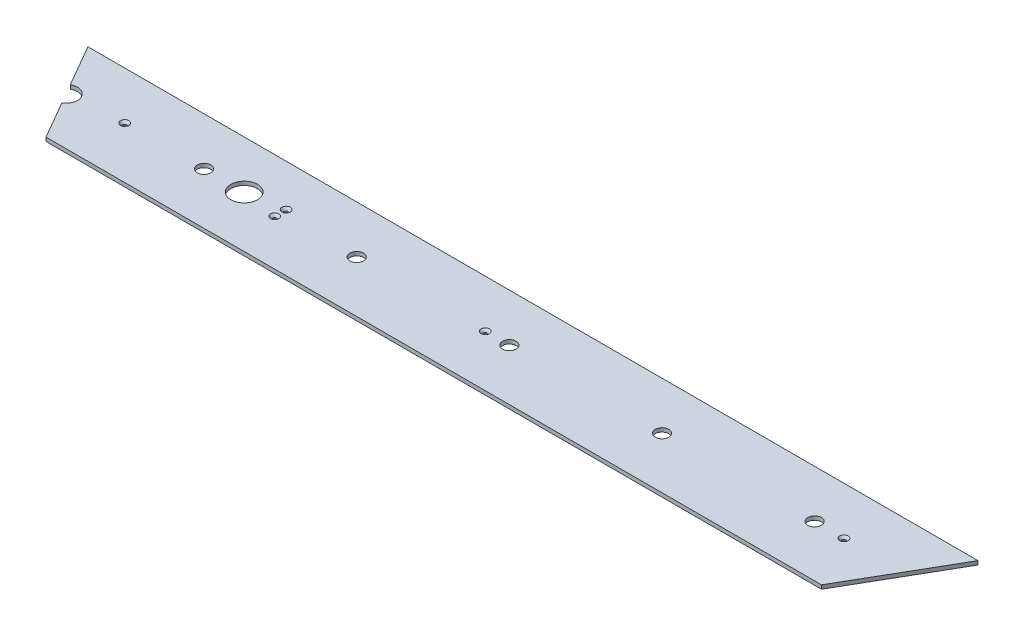
ISO-10303-21;
HEADER;
FILE_DESCRIPTION(('STEP AP214'),'2;1');
FILE_NAME('part.step','',(''),(''),'','','');
FILE_SCHEMA(('AUTOMOTIVE_DESIGN { 1 0 10303 214 1 1 1 1 }'));
ENDSEC;
DATA;
#1=APPLICATION_CONTEXT('core data for automotive mechanical design processes');
#2=APPLICATION_PROTOCOL_DEFINITION('international standard','automotive_design',2000,#1);
#3=PRODUCT_CONTEXT('',#1,'mechanical');
#4=PRODUCT('Part','Part','',(#3));
#5=PRODUCT_RELATED_PRODUCT_CATEGORY('part','',(#4));
#6=PRODUCT_DEFINITION_FORMATION('','',#4);
#7=PRODUCT_DEFINITION_CONTEXT('part definition',#1,'design');
#8=PRODUCT_DEFINITION('design','',#6,#7);
#9=PRODUCT_DEFINITION_SHAPE('','',#8);
#10=(LENGTH_UNIT() NAMED_UNIT(*) SI_UNIT(.MILLI.,.METRE.));
#11=(NAMED_UNIT(*) PLANE_ANGLE_UNIT() SI_UNIT($,.RADIAN.));
#12=(NAMED_UNIT(*) SI_UNIT($,.STERADIAN.) SOLID_ANGLE_UNIT());
#13=UNCERTAINTY_MEASURE_WITH_UNIT(LENGTH_MEASURE(1.E-05),#10,'distance_accuracy_value','');
#14=(GEOMETRIC_REPRESENTATION_CONTEXT(3) GLOBAL_UNCERTAINTY_ASSIGNED_CONTEXT((#13)) GLOBAL_UNIT_ASSIGNED_CONTEXT((#10,
#11,#12)) REPRESENTATION_CONTEXT('',''));
#15=CARTESIAN_POINT('',(0.,0.,0.));
#16=DIRECTION('',(0.,0.,1.));
#17=DIRECTION('',(1.,0.,0.));
#18=AXIS2_PLACEMENT_3D('',#15,#16,#17);
#19=CARTESIAN_POINT('',(-600.075,6.35000000005448,0.));
#20=DIRECTION('',(0.,1.,0.));
#21=DIRECTION('',(-1.,0.,0.));
#22=AXIS2_PLACEMENT_3D('',#19,#20,#21);
#23=CONICAL_SURFACE('',#22,6.97229999997262,0.715584993314902);
#24=CARTESIAN_POINT('',(-600.075,2.20085122883459,0.));
#25=DIRECTION('',(0.,1.,0.));
#26=DIRECTION('',(0.,0.,1.));
#27=AXIS2_PLACEMENT_3D('',#24,#25,#26);
#28=CIRCLE('',#27,3.3655);
#29=CARTESIAN_POINT('',(-600.075,2.20085122883459,3.3655));
#30=VERTEX_POINT('',#29);
#31=EDGE_CURVE('E111',#30,#30,#28,.F.);
#32=ORIENTED_EDGE('',*,*,#31,.T.);
#33=EDGE_LOOP('',(#32));
#34=FACE_BOUND('',#33,.T.);
#35=CARTESIAN_POINT('',(-600.075,6.35000000005448,0.));
#36=DIRECTION('',(0.,1.,0.));
#37=DIRECTION('',(-1.,0.,0.));
#38=AXIS2_PLACEMENT_3D('',#35,#36,#37);
#39=CIRCLE('',#38,6.97229999997262);
#40=CARTESIAN_POINT('',(-607.047299999973,6.35000000005448,0.));
#41=VERTEX_POINT('',#40);
#42=EDGE_CURVE('E19',#41,#41,#39,.F.);
#43=ORIENTED_EDGE('',*,*,#42,.F.);
#44=EDGE_LOOP('',(#43));
#45=FACE_BOUND('',#44,.T.);
#46=ADVANCED_FACE('F16',(#34,#45),#23,.F.);
#47=CARTESIAN_POINT('',(596.9,6.35000000005448,0.));
#48=DIRECTION('',(0.,1.,0.));
#49=DIRECTION('',(-1.,0.,0.));
#50=AXIS2_PLACEMENT_3D('',#47,#48,#49);
#51=CONICAL_SURFACE('',#50,6.97229999997262,0.715584993314902);
#52=CARTESIAN_POINT('',(596.9,2.20085122883459,0.));
#53=DIRECTION('',(0.,1.,0.));
#54=DIRECTION('',(0.,0.,1.));
#55=AXIS2_PLACEMENT_3D('',#52,#53,#54);
#56=CIRCLE('',#55,3.3655);
#57=CARTESIAN_POINT('',(596.9,2.20085122883459,3.3655));
#58=VERTEX_POINT('',#57);
#59=EDGE_CURVE('E108',#58,#58,#56,.F.);
#60=ORIENTED_EDGE('',*,*,#59,.T.);
#61=EDGE_LOOP('',(#60));
#62=FACE_BOUND('',#61,.T.);
#63=CARTESIAN_POINT('',(596.9,6.35000000005448,0.));
#64=DIRECTION('',(0.,1.,0.));
#65=DIRECTION('',(-1.,0.,0.));
#66=AXIS2_PLACEMENT_3D('',#63,#64,#65);
#67=CIRCLE('',#66,6.97229999997262);
#68=CARTESIAN_POINT('',(589.927700000027,6.35000000005448,0.));
#69=VERTEX_POINT('',#68);
#70=EDGE_CURVE('E188',#69,#69,#67,.F.);
#71=ORIENTED_EDGE('',*,*,#70,.F.);
#72=EDGE_LOOP('',(#71));
#73=FACE_BOUND('',#72,.T.);
#74=ADVANCED_FACE('F198',(#62,#73),#51,.F.);
#75=CARTESIAN_POINT('',(0.,6.35,0.));
#76=DIRECTION('',(0.,1.,0.));
#77=DIRECTION('',(0.,0.,1.));
#78=AXIS2_PLACEMENT_3D('',#75,#76,#77);
#79=PLANE('',#78);
#80=CARTESIAN_POINT('',(-467.903103407568,6.35,0.));
#81=DIRECTION('',(0.,1.,0.));
#82=DIRECTION('',(0.,0.,1.));
#83=AXIS2_PLACEMENT_3D('',#80,#81,#82);
#84=CIRCLE('',#83,11.303);
#85=CARTESIAN_POINT('',(-467.903103407568,6.35,11.303));
#86=VERTEX_POINT('',#85);
#87=EDGE_CURVE('E177',#86,#86,#84,.F.);
#88=ORIENTED_EDGE('',*,*,#87,.T.);
#89=EDGE_LOOP('',(#88));
#90=FACE_BOUND('',#89,.T.);
#91=ORIENTED_EDGE('',*,*,#70,.T.);
#92=EDGE_LOOP('',(#91));
#93=FACE_BOUND('',#92,.T.);
#94=ORIENTED_EDGE('',*,*,#42,.T.);
#95=EDGE_LOOP('',(#94));
#96=FACE_BOUND('',#95,.T.);
#97=CARTESIAN_POINT('',(-340.903103407568,6.35000000005448,9.525));
#98=DIRECTION('',(0.,1.,0.));
#99=DIRECTION('',(-1.,0.,0.));
#100=AXIS2_PLACEMENT_3D('',#97,#98,#99);
#101=CIRCLE('',#100,6.97229999997616);
#102=CARTESIAN_POINT('',(-347.875403407544,6.35000000005448,9.525));
#103=VERTEX_POINT('',#102);
#104=EDGE_CURVE('E183',#103,#103,#101,.F.);
#105=ORIENTED_EDGE('',*,*,#104,.T.);
#106=EDGE_LOOP('',(#105));
#107=FACE_BOUND('',#106,.T.);
#108=CARTESIAN_POINT('',(-340.903103407568,6.34999999994079,-9.525));
#109=DIRECTION('',(0.,1.,0.));
#110=DIRECTION('',(0.,0.,1.));
#111=AXIS2_PLACEMENT_3D('',#108,#109,#110);
#112=CIRCLE('',#111,6.97230000006047);
#113=CARTESIAN_POINT('',(-340.903103407568,6.34999999994079,-2.55269999993953));
#114=VERTEX_POINT('',#113);
#115=EDGE_CURVE('E186',#114,#114,#112,.F.);
#116=ORIENTED_EDGE('',*,*,#115,.T.);
#117=EDGE_LOOP('',(#116));
#118=FACE_BOUND('',#117,.T.);
#119=CARTESIAN_POINT('',(0.,6.35000000005448,0.));
#120=DIRECTION('',(0.,1.,0.));
#121=DIRECTION('',(-1.,0.,0.));
#122=AXIS2_PLACEMENT_3D('',#119,#120,#121);
#123=CIRCLE('',#122,6.97229999997262);
#124=CARTESIAN_POINT('',(-6.97229999997262,6.35000000005448,0.));
#125=VERTEX_POINT('',#124);
#126=EDGE_CURVE('E87',#125,#125,#123,.F.);
#127=ORIENTED_EDGE('',*,*,#126,.T.);
#128=EDGE_LOOP('',(#127));
#129=FACE_BOUND('',#128,.T.);
#130=CARTESIAN_POINT('',(-401.228103407568,6.35,0.));
#131=DIRECTION('',(0.,1.,0.));
#132=DIRECTION('',(0.,0.,1.));
#133=AXIS2_PLACEMENT_3D('',#130,#131,#132);
#134=CIRCLE('',#133,22.225);
#135=CARTESIAN_POINT('',(-401.228103407568,6.35,22.225));
#136=VERTEX_POINT('',#135);
#137=EDGE_CURVE('E107',#136,#136,#134,.F.);
#138=ORIENTED_EDGE('',*,*,#137,.T.);
#139=EDGE_LOOP('',(#138));
#140=FACE_BOUND('',#139,.T.);
#141=CARTESIAN_POINT('',(548.096896592432,6.35,0.));
#142=DIRECTION('',(0.,1.,0.));
#143=DIRECTION('',(0.,0.,1.));
#144=AXIS2_PLACEMENT_3D('',#141,#142,#143);
#145=CIRCLE('',#144,11.303);
#146=CARTESIAN_POINT('',(548.096896592432,6.35,11.303));
#147=VERTEX_POINT('',#146);
#148=EDGE_CURVE('E114',#147,#147,#145,.F.);
#149=ORIENTED_EDGE('',*,*,#148,.T.);
#150=EDGE_LOOP('',(#149));
#151=FACE_BOUND('',#150,.T.);
#152=CARTESIAN_POINT('',(294.096896592432,6.35,0.));
#153=DIRECTION('',(0.,1.,0.));
#154=DIRECTION('',(0.,0.,1.));
#155=AXIS2_PLACEMENT_3D('',#152,#153,#154);
#156=CIRCLE('',#155,11.303);
#157=CARTESIAN_POINT('',(294.096896592432,6.35,11.303));
#158=VERTEX_POINT('',#157);
#159=EDGE_CURVE('E168',#158,#158,#156,.F.);
#160=ORIENTED_EDGE('',*,*,#159,.T.);
#161=EDGE_LOOP('',(#160));
#162=FACE_BOUND('',#161,.T.);
#163=CARTESIAN_POINT('',(40.096896592432,6.35,0.));
#164=DIRECTION('',(0.,1.,0.));
#165=DIRECTION('',(0.,0.,1.));
#166=AXIS2_PLACEMENT_3D('',#163,#164,#165);
#167=CIRCLE('',#166,11.303);
#168=CARTESIAN_POINT('',(40.096896592432,6.35,11.303));
#169=VERTEX_POINT('',#168);
#170=EDGE_CURVE('E171',#169,#169,#167,.F.);
#171=ORIENTED_EDGE('',*,*,#170,.T.);
#172=EDGE_LOOP('',(#171));
#173=FACE_BOUND('',#172,.T.);
#174=CARTESIAN_POINT('',(-213.903103407568,6.35,0.));
#175=DIRECTION('',(0.,1.,0.));
#176=DIRECTION('',(0.,0.,1.));
#177=AXIS2_PLACEMENT_3D('',#174,#175,#176);
#178=CIRCLE('',#177,11.303);
#179=CARTESIAN_POINT('',(-213.903103407568,6.35,11.303));
#180=VERTEX_POINT('',#179);
#181=EDGE_CURVE('E174',#180,#180,#178,.F.);
#182=ORIENTED_EDGE('',*,*,#181,.T.);
#183=EDGE_LOOP('',(#182));
#184=FACE_BOUND('',#183,.T.);
#185=DIRECTION('',(0.500000000000017,0.,0.866025403784429));
#186=VECTOR('',#185,1.);
#187=CARTESIAN_POINT('',(-740.58367420942,6.35,-79.375));
#188=LINE('',#187,#186);
#189=CARTESIAN_POINT('',(-700.395351930546,6.35,-9.76678394204162));
#190=VERTEX_POINT('',#189);
#191=CARTESIAN_POINT('',(-740.58367420942,6.35,-79.375));
#192=VERTEX_POINT('',#191);
#193=EDGE_CURVE('E83',#190,#192,#188,.F.);
#194=ORIENTED_EDGE('',*,*,#193,.F.);
#195=CARTESIAN_POINT('',(-690.870351930396,6.35,6.731));
#196=DIRECTION('',(0.,1.,0.));
#197=DIRECTION('',(0.,0.,1.));
#198=AXIS2_PLACEMENT_3D('',#195,#196,#197);
#199=CIRCLE('',#198,19.05);
#200=CARTESIAN_POINT('',(-681.345351930531,6.35,23.228783942171));
#201=VERTEX_POINT('',#200);
#202=EDGE_CURVE('E77',#190,#201,#199,.F.);
#203=ORIENTED_EDGE('',*,*,#202,.T.);
#204=DIRECTION('',(0.500000000000017,0.,0.866025403784429));
#205=VECTOR('',#204,1.);
#206=CARTESIAN_POINT('',(-740.58367420942,6.35,-79.375));
#207=LINE('',#206,#205);
#208=CARTESIAN_POINT('',(-645.26314476607,6.35,85.7250000000266));
#209=VERTEX_POINT('',#208);
#210=EDGE_CURVE('E67',#209,#201,#207,.F.);
#211=ORIENTED_EDGE('',*,*,#210,.F.);
#212=DIRECTION('',(1.,0.,0.));
#213=VECTOR('',#212,1.);
#214=CARTESIAN_POINT('',(-645.263144766024,6.35,85.725));
#215=LINE('',#214,#213);
#216=CARTESIAN_POINT('',(645.263144766024,6.35,85.725));
#217=VERTEX_POINT('',#216);
#218=EDGE_CURVE('E91',#217,#209,#215,.F.);
#219=ORIENTED_EDGE('',*,*,#218,.F.);
#220=DIRECTION('',(0.500000000000017,0.,-0.866025403784429));
#221=VECTOR('',#220,1.);
#222=CARTESIAN_POINT('',(645.263144766024,6.35,85.725));
#223=LINE('',#222,#221);
#224=CARTESIAN_POINT('',(740.583674209374,6.35,-79.3750000000266));
#225=VERTEX_POINT('',#224);
#226=EDGE_CURVE('E124',#225,#217,#223,.F.);
#227=ORIENTED_EDGE('',*,*,#226,.F.);
#228=DIRECTION('',(-1.,0.,0.));
#229=VECTOR('',#228,1.);
#230=CARTESIAN_POINT('',(740.58367420942,6.35,-79.375));
#231=LINE('',#230,#229);
#232=EDGE_CURVE('E119',#192,#225,#231,.F.);
#233=ORIENTED_EDGE('',*,*,#232,.F.);
#234=EDGE_LOOP('',(#194,#203,#211,#219,#227,#233));
#235=FACE_BOUND('',#234,.T.);
#236=ADVANCED_FACE('F81',(#90,#93,#96,#107,#118,#129,#140,#151,#162,#173,#184,#235),#79,.T.);
#237=CARTESIAN_POINT('',(-340.903103407568,6.34999999977026,-9.525));
#238=DIRECTION('',(0.,1.,0.));
#239=DIRECTION('',(0.,0.,1.));
#240=AXIS2_PLACEMENT_3D('',#237,#238,#239);
#241=CONICAL_SURFACE('',#240,6.97229999991223,0.715584993320666);
#242=CARTESIAN_POINT('',(-340.903103407568,2.20085122883459,-9.525));
#243=DIRECTION('',(0.,1.,0.));
#244=DIRECTION('',(0.,0.,1.));
#245=AXIS2_PLACEMENT_3D('',#242,#243,#244);
#246=CIRCLE('',#245,3.3655);
#247=CARTESIAN_POINT('',(-340.903103407568,2.20085122883459,-6.1595));
#248=VERTEX_POINT('',#247);
#249=EDGE_CURVE('E104',#248,#248,#246,.F.);
#250=ORIENTED_EDGE('',*,*,#249,.T.);
#251=EDGE_LOOP('',(#250));
#252=FACE_BOUND('',#251,.T.);
#253=ORIENTED_EDGE('',*,*,#115,.F.);
#254=EDGE_LOOP('',(#253));
#255=FACE_BOUND('',#254,.T.);
#256=ADVANCED_FACE('F284',(#252,#255),#241,.F.);
#257=CARTESIAN_POINT('',(-340.903103407568,6.35000000005448,9.525));
#258=DIRECTION('',(0.,1.,0.));
#259=DIRECTION('',(-1.,0.,0.));
#260=AXIS2_PLACEMENT_3D('',#257,#258,#259);
#261=CONICAL_SURFACE('',#260,6.97229999997617,0.715584993314902);
#262=CARTESIAN_POINT('',(-340.903103407568,2.20085122883459,9.525));
#263=DIRECTION('',(0.,1.,0.));
#264=DIRECTION('',(0.,0.,1.));
#265=AXIS2_PLACEMENT_3D('',#262,#263,#264);
#266=CIRCLE('',#265,3.3655);
#267=CARTESIAN_POINT('',(-340.903103407568,2.20085122883459,12.8905));
#268=VERTEX_POINT('',#267);
#269=EDGE_CURVE('E101',#268,#268,#266,.F.);
#270=ORIENTED_EDGE('',*,*,#269,.T.);
#271=EDGE_LOOP('',(#270));
#272=FACE_BOUND('',#271,.T.);
#273=ORIENTED_EDGE('',*,*,#104,.F.);
#274=EDGE_LOOP('',(#273));
#275=FACE_BOUND('',#274,.T.);
#276=ADVANCED_FACE('F280',(#272,#275),#261,.F.);
#277=CARTESIAN_POINT('',(0.,6.35000000005448,0.));
#278=DIRECTION('',(0.,1.,0.));
#279=DIRECTION('',(-1.,0.,0.));
#280=AXIS2_PLACEMENT_3D('',#277,#278,#279);
#281=CONICAL_SURFACE('',#280,6.97229999997262,0.715584993314902);
#282=CARTESIAN_POINT('',(0.,2.20085122883459,0.));
#283=DIRECTION('',(0.,1.,0.));
#284=DIRECTION('',(0.,0.,1.));
#285=AXIS2_PLACEMENT_3D('',#282,#283,#284);
#286=CIRCLE('',#285,3.3655);
#287=CARTESIAN_POINT('',(0.,2.20085122883459,3.3655));
#288=VERTEX_POINT('',#287);
#289=EDGE_CURVE('E98',#288,#288,#286,.F.);
#290=ORIENTED_EDGE('',*,*,#289,.T.);
#291=EDGE_LOOP('',(#290));
#292=FACE_BOUND('',#291,.T.);
#293=ORIENTED_EDGE('',*,*,#126,.F.);
#294=EDGE_LOOP('',(#293));
#295=FACE_BOUND('',#294,.T.);
#296=ADVANCED_FACE('F277',(#292,#295),#281,.F.);
#297=CARTESIAN_POINT('',(-690.870351930396,6.35,6.731));
#298=DIRECTION('',(0.,1.,0.));
#299=DIRECTION('',(0.,0.,1.));
#300=AXIS2_PLACEMENT_3D('',#297,#298,#299);
#301=CYLINDRICAL_SURFACE('',#300,19.05);
#302=CARTESIAN_POINT('',(-690.870351930396,0.,6.731));
#303=DIRECTION('',(0.,1.,0.));
#304=DIRECTION('',(0.,0.,1.));
#305=AXIS2_PLACEMENT_3D('',#302,#303,#304);
#306=CIRCLE('',#305,19.05);
#307=CARTESIAN_POINT('',(-700.395351930591,0.,-9.76678394201604));
#308=VERTEX_POINT('',#307);
#309=CARTESIAN_POINT('',(-681.345351930463,0.,23.2287839421321));
#310=VERTEX_POINT('',#309);
#311=EDGE_CURVE('E90',#308,#310,#306,.F.);
#312=ORIENTED_EDGE('',*,*,#311,.T.);
#313=DIRECTION('',(0.,1.,0.));
#314=VECTOR('',#313,1.);
#315=CARTESIAN_POINT('',(-681.345351930531,0.,23.2287839421708));
#316=LINE('',#315,#314);
#317=EDGE_CURVE('E72',#201,#310,#316,.F.);
#318=ORIENTED_EDGE('',*,*,#317,.F.);
#319=ORIENTED_EDGE('',*,*,#202,.F.);
#320=DIRECTION('',(0.,1.,0.));
#321=VECTOR('',#320,1.);
#322=CARTESIAN_POINT('',(-700.395351930561,0.,-9.76678394206776));
#323=LINE('',#322,#321);
#324=EDGE_CURVE('E179',#308,#190,#323,.T.);
#325=ORIENTED_EDGE('',*,*,#324,.F.);
#326=EDGE_LOOP('',(#312,#318,#319,#325));
#327=FACE_BOUND('',#326,.T.);
#328=ADVANCED_FACE('F89',(#327),#301,.F.);
#329=CARTESIAN_POINT('',(-740.58367420942,0.,-79.375));
#330=DIRECTION('',(-0.866025403784429,0.,0.500000000000017));
#331=DIRECTION('',(0.500000000000017,0.,0.866025403784429));
#332=AXIS2_PLACEMENT_3D('',#329,#330,#331);
#333=PLANE('',#332);
#334=ORIENTED_EDGE('',*,*,#210,.T.);
#335=ORIENTED_EDGE('',*,*,#317,.T.);
#336=DIRECTION('',(0.499999999999912,0.,0.866025403784489));
#337=VECTOR('',#336,1.);
#338=CARTESIAN_POINT('',(-681.345351930396,0.,23.2287839420928));
#339=LINE('',#338,#337);
#340=CARTESIAN_POINT('',(-645.263144766024,0.,85.7250000000169));
#341=VERTEX_POINT('',#340);
#342=EDGE_CURVE('E163',#310,#341,#339,.T.);
#343=ORIENTED_EDGE('',*,*,#342,.T.);
#344=DIRECTION('',(0.,1.,0.));
#345=VECTOR('',#344,1.);
#346=CARTESIAN_POINT('',(-645.263144766024,0.,85.725));
#347=LINE('',#346,#345);
#348=EDGE_CURVE('E74',#209,#341,#347,.F.);
#349=ORIENTED_EDGE('',*,*,#348,.F.);
#350=EDGE_LOOP('',(#334,#335,#343,#349));
#351=FACE_BOUND('',#350,.T.);
#352=ADVANCED_FACE('F69',(#351),#333,.T.);
#353=CARTESIAN_POINT('',(-645.263144766024,0.,85.725));
#354=DIRECTION('',(0.,0.,1.));
#355=DIRECTION('',(1.,0.,0.));
#356=AXIS2_PLACEMENT_3D('',#353,#354,#355);
#357=PLANE('',#356);
#358=ORIENTED_EDGE('',*,*,#348,.T.);
#359=DIRECTION('',(1.,0.,0.));
#360=VECTOR('',#359,1.);
#361=CARTESIAN_POINT('',(0.,0.,85.7250000000254));
#362=LINE('',#361,#360);
#363=CARTESIAN_POINT('',(645.263144766014,0.,85.7250000000169));
#364=VERTEX_POINT('',#363);
#365=EDGE_CURVE('E309',#341,#364,#362,.T.);
#366=ORIENTED_EDGE('',*,*,#365,.T.);
#367=DIRECTION('',(0.,1.,0.));
#368=VECTOR('',#367,1.);
#369=CARTESIAN_POINT('',(645.263144766024,0.,85.725));
#370=LINE('',#369,#368);
#371=EDGE_CURVE('E121',#217,#364,#370,.F.);
#372=ORIENTED_EDGE('',*,*,#371,.F.);
#373=ORIENTED_EDGE('',*,*,#218,.T.);
#374=EDGE_LOOP('',(#358,#366,#372,#373));
#375=FACE_BOUND('',#374,.T.);
#376=ADVANCED_FACE('F268',(#375),#357,.T.);
#377=CARTESIAN_POINT('',(645.263144766024,0.,85.725));
#378=DIRECTION('',(0.866025403784429,0.,0.500000000000017));
#379=DIRECTION('',(0.500000000000017,0.,-0.866025403784429));
#380=AXIS2_PLACEMENT_3D('',#377,#378,#379);
#381=PLANE('',#380);
#382=ORIENTED_EDGE('',*,*,#371,.T.);
#383=DIRECTION('',(0.500000000000685,0.,-0.866025403784043));
#384=VECTOR('',#383,1.);
#385=CARTESIAN_POINT('',(645.263144766024,0.,85.725));
#386=LINE('',#385,#384);
#387=CARTESIAN_POINT('',(740.58367420942,0.,-79.3750000000169));
#388=VERTEX_POINT('',#387);
#389=EDGE_CURVE('E304',#364,#388,#386,.T.);
#390=ORIENTED_EDGE('',*,*,#389,.T.);
#391=DIRECTION('',(0.,1.,0.));
#392=VECTOR('',#391,1.);
#393=CARTESIAN_POINT('',(740.58367420942,0.,-79.375));
#394=LINE('',#393,#392);
#395=EDGE_CURVE('E116',#225,#388,#394,.F.);
#396=ORIENTED_EDGE('',*,*,#395,.F.);
#397=ORIENTED_EDGE('',*,*,#226,.T.);
#398=EDGE_LOOP('',(#382,#390,#396,#397));
#399=FACE_BOUND('',#398,.T.);
#400=ADVANCED_FACE('F264',(#399),#381,.T.);
#401=CARTESIAN_POINT('',(740.58367420942,0.,-79.375));
#402=DIRECTION('',(0.,0.,-1.));
#403=DIRECTION('',(-1.,0.,0.));
#404=AXIS2_PLACEMENT_3D('',#401,#402,#403);
#405=PLANE('',#404);
#406=ORIENTED_EDGE('',*,*,#395,.T.);
#407=DIRECTION('',(1.,0.,0.));
#408=VECTOR('',#407,1.);
#409=CARTESIAN_POINT('',(0.,0.,-79.3750000000254));
#410=LINE('',#409,#408);
#411=CARTESIAN_POINT('',(-740.58367420943,0.,-79.3750000000169));
#412=VERTEX_POINT('',#411);
#413=EDGE_CURVE('E301',#388,#412,#410,.F.);
#414=ORIENTED_EDGE('',*,*,#413,.T.);
#415=DIRECTION('',(0.,1.,0.));
#416=VECTOR('',#415,1.);
#417=CARTESIAN_POINT('',(-740.58367420942,0.,-79.375));
#418=LINE('',#417,#416);
#419=EDGE_CURVE('E34',#192,#412,#418,.F.);
#420=ORIENTED_EDGE('',*,*,#419,.F.);
#421=ORIENTED_EDGE('',*,*,#232,.T.);
#422=EDGE_LOOP('',(#406,#414,#420,#421));
#423=FACE_BOUND('',#422,.T.);
#424=ADVANCED_FACE('F261',(#423),#405,.T.);
#425=CARTESIAN_POINT('',(-740.58367420942,0.,-79.375));
#426=DIRECTION('',(-0.866025403784429,0.,0.500000000000017));
#427=DIRECTION('',(0.500000000000017,0.,0.866025403784429));
#428=AXIS2_PLACEMENT_3D('',#425,#426,#427);
#429=PLANE('',#428);
#430=DIRECTION('',(0.499999999998914,0.,0.866025403785065));
#431=VECTOR('',#430,1.);
#432=CARTESIAN_POINT('',(-740.58367420942,0.,-79.375));
#433=LINE('',#432,#431);
#434=EDGE_CURVE('E161',#412,#308,#433,.T.);
#435=ORIENTED_EDGE('',*,*,#434,.T.);
#436=ORIENTED_EDGE('',*,*,#324,.T.);
#437=ORIENTED_EDGE('',*,*,#193,.T.);
#438=ORIENTED_EDGE('',*,*,#419,.T.);
#439=EDGE_LOOP('',(#435,#436,#437,#438));
#440=FACE_BOUND('',#439,.T.);
#441=ADVANCED_FACE('F257',(#440),#429,.T.);
#442=CARTESIAN_POINT('',(-467.903103407568,6.35,0.));
#443=DIRECTION('',(0.,1.,0.));
#444=DIRECTION('',(0.,0.,1.));
#445=AXIS2_PLACEMENT_3D('',#442,#443,#444);
#446=CYLINDRICAL_SURFACE('',#445,11.303);
#447=ORIENTED_EDGE('',*,*,#87,.F.);
#448=EDGE_LOOP('',(#447));
#449=FACE_BOUND('',#448,.T.);
#450=CARTESIAN_POINT('',(-467.903103407568,0.,0.));
#451=DIRECTION('',(0.,1.,0.));
#452=DIRECTION('',(0.,0.,1.));
#453=AXIS2_PLACEMENT_3D('',#450,#451,#452);
#454=CIRCLE('',#453,11.303);
#455=CARTESIAN_POINT('',(-467.903103407568,0.,11.303));
#456=VERTEX_POINT('',#455);
#457=EDGE_CURVE('E158',#456,#456,#454,.F.);
#458=ORIENTED_EDGE('',*,*,#457,.T.);
#459=EDGE_LOOP('',(#458));
#460=FACE_BOUND('',#459,.T.);
#461=ADVANCED_FACE('F253',(#449,#460),#446,.F.);
#462=CARTESIAN_POINT('',(-213.903103407568,6.35,0.));
#463=DIRECTION('',(0.,1.,0.));
#464=DIRECTION('',(0.,0.,1.));
#465=AXIS2_PLACEMENT_3D('',#462,#463,#464);
#466=CYLINDRICAL_SURFACE('',#465,11.303);
#467=ORIENTED_EDGE('',*,*,#181,.F.);
#468=EDGE_LOOP('',(#467));
#469=FACE_BOUND('',#468,.T.);
#470=CARTESIAN_POINT('',(-213.903103407568,0.,0.));
#471=DIRECTION('',(0.,1.,0.));
#472=DIRECTION('',(0.,0.,1.));
#473=AXIS2_PLACEMENT_3D('',#470,#471,#472);
#474=CIRCLE('',#473,11.303);
#475=CARTESIAN_POINT('',(-213.903103407568,0.,11.303));
#476=VERTEX_POINT('',#475);
#477=EDGE_CURVE('E155',#476,#476,#474,.F.);
#478=ORIENTED_EDGE('',*,*,#477,.T.);
#479=EDGE_LOOP('',(#478));
#480=FACE_BOUND('',#479,.T.);
#481=ADVANCED_FACE('F249',(#469,#480),#466,.F.);
#482=CARTESIAN_POINT('',(40.096896592432,6.35,0.));
#483=DIRECTION('',(0.,1.,0.));
#484=DIRECTION('',(0.,0.,1.));
#485=AXIS2_PLACEMENT_3D('',#482,#483,#484);
#486=CYLINDRICAL_SURFACE('',#485,11.303);
#487=ORIENTED_EDGE('',*,*,#170,.F.);
#488=EDGE_LOOP('',(#487));
#489=FACE_BOUND('',#488,.T.);
#490=CARTESIAN_POINT('',(40.096896592432,0.,0.));
#491=DIRECTION('',(0.,1.,0.));
#492=DIRECTION('',(0.,0.,1.));
#493=AXIS2_PLACEMENT_3D('',#490,#491,#492);
#494=CIRCLE('',#493,11.303);
#495=CARTESIAN_POINT('',(40.096896592432,0.,11.303));
#496=VERTEX_POINT('',#495);
#497=EDGE_CURVE('E152',#496,#496,#494,.F.);
#498=ORIENTED_EDGE('',*,*,#497,.T.);
#499=EDGE_LOOP('',(#498));
#500=FACE_BOUND('',#499,.T.);
#501=ADVANCED_FACE('F245',(#489,#500),#486,.F.);
#502=CARTESIAN_POINT('',(294.096896592432,6.35,0.));
#503=DIRECTION('',(0.,1.,0.));
#504=DIRECTION('',(0.,0.,1.));
#505=AXIS2_PLACEMENT_3D('',#502,#503,#504);
#506=CYLINDRICAL_SURFACE('',#505,11.303);
#507=ORIENTED_EDGE('',*,*,#159,.F.);
#508=EDGE_LOOP('',(#507));
#509=FACE_BOUND('',#508,.T.);
#510=CARTESIAN_POINT('',(294.096896592432,0.,0.));
#511=DIRECTION('',(0.,1.,0.));
#512=DIRECTION('',(0.,0.,1.));
#513=AXIS2_PLACEMENT_3D('',#510,#511,#512);
#514=CIRCLE('',#513,11.303);
#515=CARTESIAN_POINT('',(294.096896592432,0.,11.303));
#516=VERTEX_POINT('',#515);
#517=EDGE_CURVE('E149',#516,#516,#514,.F.);
#518=ORIENTED_EDGE('',*,*,#517,.T.);
#519=EDGE_LOOP('',(#518));
#520=FACE_BOUND('',#519,.T.);
#521=ADVANCED_FACE('F241',(#509,#520),#506,.F.);
#522=CARTESIAN_POINT('',(548.096896592432,6.35,0.));
#523=DIRECTION('',(0.,1.,0.));
#524=DIRECTION('',(0.,0.,1.));
#525=AXIS2_PLACEMENT_3D('',#522,#523,#524);
#526=CYLINDRICAL_SURFACE('',#525,11.303);
#527=ORIENTED_EDGE('',*,*,#148,.F.);
#528=EDGE_LOOP('',(#527));
#529=FACE_BOUND('',#528,.T.);
#530=CARTESIAN_POINT('',(548.096896592432,0.,0.));
#531=DIRECTION('',(0.,1.,0.));
#532=DIRECTION('',(0.,0.,1.));
#533=AXIS2_PLACEMENT_3D('',#530,#531,#532);
#534=CIRCLE('',#533,11.303);
#535=CARTESIAN_POINT('',(548.096896592432,0.,11.303));
#536=VERTEX_POINT('',#535);
#537=EDGE_CURVE('E146',#536,#536,#534,.F.);
#538=ORIENTED_EDGE('',*,*,#537,.T.);
#539=EDGE_LOOP('',(#538));
#540=FACE_BOUND('',#539,.T.);
#541=ADVANCED_FACE('F237',(#529,#540),#526,.F.);
#542=CARTESIAN_POINT('',(-600.075,6.35,0.));
#543=DIRECTION('',(0.,1.,0.));
#544=DIRECTION('',(0.,0.,1.));
#545=AXIS2_PLACEMENT_3D('',#542,#543,#544);
#546=CYLINDRICAL_SURFACE('',#545,3.3655);
#547=CARTESIAN_POINT('',(-600.075,0.,0.));
#548=DIRECTION('',(0.,1.,0.));
#549=DIRECTION('',(0.,0.,1.));
#550=AXIS2_PLACEMENT_3D('',#547,#548,#549);
#551=CIRCLE('',#550,3.3655);
#552=CARTESIAN_POINT('',(-600.075,0.,3.3655));
#553=VERTEX_POINT('',#552);
#554=EDGE_CURVE('E143',#553,#553,#551,.F.);
#555=ORIENTED_EDGE('',*,*,#554,.T.);
#556=EDGE_LOOP('',(#555));
#557=FACE_BOUND('',#556,.T.);
#558=ORIENTED_EDGE('',*,*,#31,.F.);
#559=EDGE_LOOP('',(#558));
#560=FACE_BOUND('',#559,.T.);
#561=ADVANCED_FACE('F233',(#557,#560),#546,.F.);
#562=CARTESIAN_POINT('',(596.9,6.35,0.));
#563=DIRECTION('',(0.,1.,0.));
#564=DIRECTION('',(0.,0.,1.));
#565=AXIS2_PLACEMENT_3D('',#562,#563,#564);
#566=CYLINDRICAL_SURFACE('',#565,3.3655);
#567=CARTESIAN_POINT('',(596.9,0.,0.));
#568=DIRECTION('',(0.,1.,0.));
#569=DIRECTION('',(0.,0.,1.));
#570=AXIS2_PLACEMENT_3D('',#567,#568,#569);
#571=CIRCLE('',#570,3.3655);
#572=CARTESIAN_POINT('',(596.9,0.,3.3655));
#573=VERTEX_POINT('',#572);
#574=EDGE_CURVE('E140',#573,#573,#571,.F.);
#575=ORIENTED_EDGE('',*,*,#574,.T.);
#576=EDGE_LOOP('',(#575));
#577=FACE_BOUND('',#576,.T.);
#578=ORIENTED_EDGE('',*,*,#59,.F.);
#579=EDGE_LOOP('',(#578));
#580=FACE_BOUND('',#579,.T.);
#581=ADVANCED_FACE('F229',(#577,#580),#566,.F.);
#582=CARTESIAN_POINT('',(-401.228103407568,6.35,0.));
#583=DIRECTION('',(0.,1.,0.));
#584=DIRECTION('',(0.,0.,1.));
#585=AXIS2_PLACEMENT_3D('',#582,#583,#584);
#586=CYLINDRICAL_SURFACE('',#585,22.225);
#587=ORIENTED_EDGE('',*,*,#137,.F.);
#588=EDGE_LOOP('',(#587));
#589=FACE_BOUND('',#588,.T.);
#590=CARTESIAN_POINT('',(-401.228103407568,0.,0.));
#591=DIRECTION('',(0.,1.,0.));
#592=DIRECTION('',(0.,0.,1.));
#593=AXIS2_PLACEMENT_3D('',#590,#591,#592);
#594=CIRCLE('',#593,22.225);
#595=CARTESIAN_POINT('',(-401.228103407568,0.,22.225));
#596=VERTEX_POINT('',#595);
#597=EDGE_CURVE('E137',#596,#596,#594,.F.);
#598=ORIENTED_EDGE('',*,*,#597,.T.);
#599=EDGE_LOOP('',(#598));
#600=FACE_BOUND('',#599,.T.);
#601=ADVANCED_FACE('F225',(#589,#600),#586,.F.);
#602=CARTESIAN_POINT('',(-340.903103407568,6.35,-9.525));
#603=DIRECTION('',(0.,1.,0.));
#604=DIRECTION('',(0.,0.,1.));
#605=AXIS2_PLACEMENT_3D('',#602,#603,#604);
#606=CYLINDRICAL_SURFACE('',#605,3.3655);
#607=CARTESIAN_POINT('',(-340.903103407568,0.,-9.525));
#608=DIRECTION('',(0.,1.,0.));
#609=DIRECTION('',(0.,0.,1.));
#610=AXIS2_PLACEMENT_3D('',#607,#608,#609);
#611=CIRCLE('',#610,3.3655);
#612=CARTESIAN_POINT('',(-340.903103407568,0.,-6.1595));
#613=VERTEX_POINT('',#612);
#614=EDGE_CURVE('E134',#613,#613,#611,.F.);
#615=ORIENTED_EDGE('',*,*,#614,.T.);
#616=EDGE_LOOP('',(#615));
#617=FACE_BOUND('',#616,.T.);
#618=ORIENTED_EDGE('',*,*,#249,.F.);
#619=EDGE_LOOP('',(#618));
#620=FACE_BOUND('',#619,.T.);
#621=ADVANCED_FACE('F221',(#617,#620),#606,.F.);
#622=CARTESIAN_POINT('',(-340.903103407568,6.35,9.525));
#623=DIRECTION('',(0.,1.,0.));
#624=DIRECTION('',(0.,0.,1.));
#625=AXIS2_PLACEMENT_3D('',#622,#623,#624);
#626=CYLINDRICAL_SURFACE('',#625,3.3655);
#627=CARTESIAN_POINT('',(-340.903103407568,0.,9.525));
#628=DIRECTION('',(0.,1.,0.));
#629=DIRECTION('',(0.,0.,1.));
#630=AXIS2_PLACEMENT_3D('',#627,#628,#629);
#631=CIRCLE('',#630,3.3655);
#632=CARTESIAN_POINT('',(-340.903103407568,0.,12.8905));
#633=VERTEX_POINT('',#632);
#634=EDGE_CURVE('E25',#633,#633,#631,.F.);
#635=ORIENTED_EDGE('',*,*,#634,.T.);
#636=EDGE_LOOP('',(#635));
#637=FACE_BOUND('',#636,.T.);
#638=ORIENTED_EDGE('',*,*,#269,.F.);
#639=EDGE_LOOP('',(#638));
#640=FACE_BOUND('',#639,.T.);
#641=ADVANCED_FACE('F213',(#637,#640),#626,.F.);
#642=CARTESIAN_POINT('',(0.,6.35,0.));
#643=DIRECTION('',(0.,1.,0.));
#644=DIRECTION('',(0.,0.,1.));
#645=AXIS2_PLACEMENT_3D('',#642,#643,#644);
#646=CYLINDRICAL_SURFACE('',#645,3.3655);
#647=CARTESIAN_POINT('',(0.,0.,0.));
#648=DIRECTION('',(0.,1.,0.));
#649=DIRECTION('',(0.,0.,1.));
#650=AXIS2_PLACEMENT_3D('',#647,#648,#649);
#651=CIRCLE('',#650,3.3655);
#652=CARTESIAN_POINT('',(0.,0.,3.3655));
#653=VERTEX_POINT('',#652);
#654=EDGE_CURVE('E11',#653,#653,#651,.F.);
#655=ORIENTED_EDGE('',*,*,#654,.T.);
#656=EDGE_LOOP('',(#655));
#657=FACE_BOUND('',#656,.T.);
#658=ORIENTED_EDGE('',*,*,#289,.F.);
#659=EDGE_LOOP('',(#658));
#660=FACE_BOUND('',#659,.T.);
#661=ADVANCED_FACE('F207',(#657,#660),#646,.F.);
#662=CARTESIAN_POINT('',(0.,0.,0.));
#663=DIRECTION('',(0.,1.,0.));
#664=DIRECTION('',(0.,0.,1.));
#665=AXIS2_PLACEMENT_3D('',#662,#663,#664);
#666=PLANE('',#665);
#667=ORIENTED_EDGE('',*,*,#654,.F.);
#668=EDGE_LOOP('',(#667));
#669=FACE_BOUND('',#668,.T.);
#670=ORIENTED_EDGE('',*,*,#634,.F.);
#671=EDGE_LOOP('',(#670));
#672=FACE_BOUND('',#671,.T.);
#673=ORIENTED_EDGE('',*,*,#614,.F.);
#674=EDGE_LOOP('',(#673));
#675=FACE_BOUND('',#674,.T.);
#676=ORIENTED_EDGE('',*,*,#597,.F.);
#677=EDGE_LOOP('',(#676));
#678=FACE_BOUND('',#677,.T.);
#679=ORIENTED_EDGE('',*,*,#574,.F.);
#680=EDGE_LOOP('',(#679));
#681=FACE_BOUND('',#680,.T.);
#682=ORIENTED_EDGE('',*,*,#554,.F.);
#683=EDGE_LOOP('',(#682));
#684=FACE_BOUND('',#683,.T.);
#685=ORIENTED_EDGE('',*,*,#537,.F.);
#686=EDGE_LOOP('',(#685));
#687=FACE_BOUND('',#686,.T.);
#688=ORIENTED_EDGE('',*,*,#517,.F.);
#689=EDGE_LOOP('',(#688));
#690=FACE_BOUND('',#689,.T.);
#691=ORIENTED_EDGE('',*,*,#497,.F.);
#692=EDGE_LOOP('',(#691));
#693=FACE_BOUND('',#692,.T.);
#694=ORIENTED_EDGE('',*,*,#477,.F.);
#695=EDGE_LOOP('',(#694));
#696=FACE_BOUND('',#695,.T.);
#697=ORIENTED_EDGE('',*,*,#457,.F.);
#698=EDGE_LOOP('',(#697));
#699=FACE_BOUND('',#698,.T.);
#700=ORIENTED_EDGE('',*,*,#413,.F.);
#701=ORIENTED_EDGE('',*,*,#389,.F.);
#702=ORIENTED_EDGE('',*,*,#365,.F.);
#703=ORIENTED_EDGE('',*,*,#342,.F.);
#704=ORIENTED_EDGE('',*,*,#311,.F.);
#705=ORIENTED_EDGE('',*,*,#434,.F.);
#706=EDGE_LOOP('',(#700,#701,#702,#703,#704,#705));
#707=FACE_BOUND('',#706,.T.);
#708=ADVANCED_FACE('F205',(#669,#672,#675,#678,#681,#684,#687,#690,#693,#696,#699,#707),#666,.F.);
#709=CLOSED_SHELL('',(#46,#74,#236,#256,#276,#296,#328,#352,#376,#400,#424,#441,#461,#481,#501,
#521,#541,#561,#581,#601,#621,#641,#661,#708));
#710=MANIFOLD_SOLID_BREP('B1',#709);
#711=ADVANCED_BREP_SHAPE_REPRESENTATION('',(#18,#710),#14);
#712=SHAPE_DEFINITION_REPRESENTATION(#9,#711);
ENDSEC;
END-ISO-10303-21;
